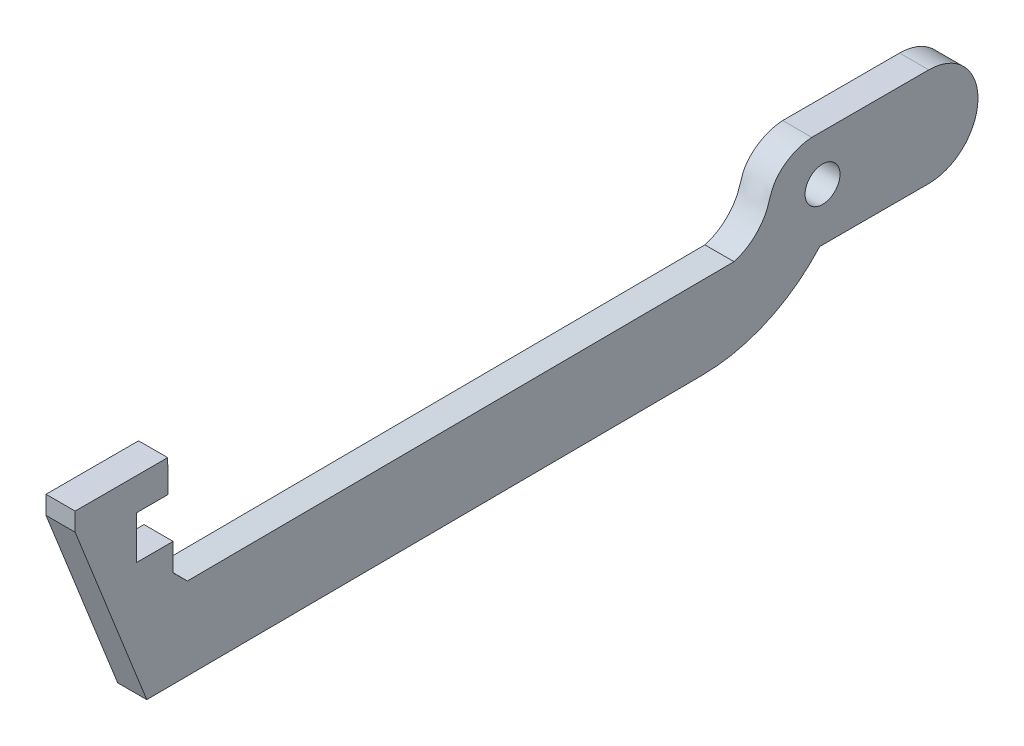
ISO-10303-21;
HEADER;
FILE_DESCRIPTION(('STEP AP214'),'2;1');
FILE_NAME('part.step','',(''),(''),'','','');
FILE_SCHEMA(('AUTOMOTIVE_DESIGN { 1 0 10303 214 1 1 1 1 }'));
ENDSEC;
DATA;
#1=APPLICATION_CONTEXT('core data for automotive mechanical design processes');
#2=APPLICATION_PROTOCOL_DEFINITION('international standard','automotive_design',2000,#1);
#3=PRODUCT_CONTEXT('',#1,'mechanical');
#4=PRODUCT('Part','Part','',(#3));
#5=PRODUCT_RELATED_PRODUCT_CATEGORY('part','',(#4));
#6=PRODUCT_DEFINITION_FORMATION('','',#4);
#7=PRODUCT_DEFINITION_CONTEXT('part definition',#1,'design');
#8=PRODUCT_DEFINITION('design','',#6,#7);
#9=PRODUCT_DEFINITION_SHAPE('','',#8);
#10=(LENGTH_UNIT() NAMED_UNIT(*) SI_UNIT(.MILLI.,.METRE.));
#11=(NAMED_UNIT(*) PLANE_ANGLE_UNIT() SI_UNIT($,.RADIAN.));
#12=(NAMED_UNIT(*) SI_UNIT($,.STERADIAN.) SOLID_ANGLE_UNIT());
#13=UNCERTAINTY_MEASURE_WITH_UNIT(LENGTH_MEASURE(1.E-05),#10,'distance_accuracy_value','');
#14=(GEOMETRIC_REPRESENTATION_CONTEXT(3) GLOBAL_UNCERTAINTY_ASSIGNED_CONTEXT((#13)) GLOBAL_UNIT_ASSIGNED_CONTEXT((#10,
#11,#12)) REPRESENTATION_CONTEXT('',''));
#15=CARTESIAN_POINT('',(0.,0.,0.));
#16=DIRECTION('',(0.,0.,1.));
#17=DIRECTION('',(1.,0.,0.));
#18=AXIS2_PLACEMENT_3D('',#15,#16,#17);
#19=CARTESIAN_POINT('',(2.54,5.34255132185554,-4.57743165751126));
#20=DIRECTION('',(1.,0.,0.));
#21=DIRECTION('',(0.,0.,-1.));
#22=AXIS2_PLACEMENT_3D('',#19,#20,#21);
#23=PLANE('',#22);
#24=DIRECTION('',(0.,-1.,0.));
#25=VECTOR('',#24,1.);
#26=CARTESIAN_POINT('',(2.54,8.68357643470394,50.0984456009479));
#27=LINE('',#26,#25);
#28=CARTESIAN_POINT('',(2.54,8.68357643470394,50.0984456009479));
#29=VERTEX_POINT('',#28);
#30=CARTESIAN_POINT('',(2.54,7.08858013780235,50.0984456009479));
#31=VERTEX_POINT('',#30);
#32=EDGE_CURVE('E214',#29,#31,#27,.T.);
#33=ORIENTED_EDGE('',*,*,#32,.T.);
#34=DIRECTION('',(0.,-0.929681500465451,-0.368364368108952));
#35=VECTOR('',#34,1.);
#36=CARTESIAN_POINT('',(2.54,7.08858013780235,50.0984456009479));
#37=LINE('',#36,#35);
#38=CARTESIAN_POINT('',(2.54,-8.68357643470394,43.8491005439171));
#39=VERTEX_POINT('',#38);
#40=EDGE_CURVE('E117',#31,#39,#37,.T.);
#41=ORIENTED_EDGE('',*,*,#40,.T.);
#42=DIRECTION('',(0.,0.00589535992765672,-0.999982622214668));
#43=VECTOR('',#42,1.);
#44=CARTESIAN_POINT('',(2.54,-8.68357643470394,43.8491005439171));
#45=LINE('',#44,#43);
#46=CARTESIAN_POINT('',(2.54,-8.39760207670546,-4.65843621493681));
#47=VERTEX_POINT('',#46);
#48=EDGE_CURVE('E253',#39,#47,#45,.T.);
#49=ORIENTED_EDGE('',*,*,#48,.T.);
#50=CARTESIAN_POINT('',(2.54,5.34255132185554,-4.57743165751126));
#51=DIRECTION('',(1.,0.,0.));
#52=DIRECTION('',(0.,0.,-1.));
#53=AXIS2_PLACEMENT_3D('',#50,#51,#52);
#54=CIRCLE('',#53,13.7403921761466);
#55=CARTESIAN_POINT('',(2.54,-3.8040165943915,-14.8311467163468));
#56=VERTEX_POINT('',#55);
#57=EDGE_CURVE('E272',#47,#56,#54,.T.);
#58=ORIENTED_EDGE('',*,*,#57,.T.);
#59=DIRECTION('',(0.,0.,-1.));
#60=VECTOR('',#59,1.);
#61=CARTESIAN_POINT('',(2.54,-3.8040165943915,-14.8311467163468));
#62=LINE('',#61,#60);
#63=CARTESIAN_POINT('',(2.54,-3.8040165943915,-24.3340609444598));
#64=VERTEX_POINT('',#63);
#65=EDGE_CURVE('E269',#56,#64,#62,.T.);
#66=ORIENTED_EDGE('',*,*,#65,.T.);
#67=CARTESIAN_POINT('',(2.54,0.491128013845706,-24.3340609444598));
#68=DIRECTION('',(1.,0.,0.));
#69=DIRECTION('',(0.,0.,-1.));
#70=AXIS2_PLACEMENT_3D('',#67,#68,#69);
#71=CIRCLE('',#70,4.2951446082372);
#72=CARTESIAN_POINT('',(2.54,4.78627262208291,-24.3340609444598));
#73=VERTEX_POINT('',#72);
#74=EDGE_CURVE('E271',#64,#73,#71,.T.);
#75=ORIENTED_EDGE('',*,*,#74,.T.);
#76=DIRECTION('',(0.,0.,1.));
#77=VECTOR('',#76,1.);
#78=CARTESIAN_POINT('',(2.54,4.78627262208291,-24.3340609444598));
#79=LINE('',#78,#77);
#80=CARTESIAN_POINT('',(2.54,4.78627262208291,-14.1345902188231));
#81=VERTEX_POINT('',#80);
#82=EDGE_CURVE('E274',#73,#81,#79,.T.);
#83=ORIENTED_EDGE('',*,*,#82,.T.);
#84=CARTESIAN_POINT('',(2.54,4.78627262208291,-14.1345902188231));
#85=CARTESIAN_POINT('',(2.54,4.73144775631799,-12.8433861654983));
#86=CARTESIAN_POINT('',(2.54,3.66079130025576,-10.8140470518953));
#87=CARTESIAN_POINT('',(2.54,0.480505821714619,-10.1658975675965));
#88=CARTESIAN_POINT('',(2.54,-0.85759459417996,-8.61344436264116));
#89=CARTESIAN_POINT('',(2.54,-1.2101195078244,-7.35362341771294));
#90=B_SPLINE_CURVE_WITH_KNOTS('',3,(#84,#85,#86,#87,#88,#89),.UNSPECIFIED.,.F.,.F.,(4,1,1,4),
(0.,0.424423340397801,0.5877625423736,1.),.UNSPECIFIED.);
#91=CARTESIAN_POINT('',(2.54,-1.2101195078244,-7.35362341771294));
#92=VERTEX_POINT('',#91);
#93=EDGE_CURVE('E280',#81,#92,#90,.T.);
#94=ORIENTED_EDGE('',*,*,#93,.T.);
#95=DIRECTION('',(0.,-0.00589535992765674,0.999982622214668));
#96=VECTOR('',#95,1.);
#97=CARTESIAN_POINT('',(2.54,-1.2101195078244,-7.35362341771294));
#98=LINE('',#97,#96);
#99=CARTESIAN_POINT('',(2.54,-1.49108991479145,40.3051332606615));
#100=VERTEX_POINT('',#99);
#101=EDGE_CURVE('E285',#92,#100,#98,.T.);
#102=ORIENTED_EDGE('',*,*,#101,.T.);
#103=DIRECTION('',(0.,0.702925844254296,0.711263142219099));
#104=VECTOR('',#103,1.);
#105=CARTESIAN_POINT('',(2.54,-1.49108991479145,40.3051332606615));
#106=LINE('',#105,#104);
#107=CARTESIAN_POINT('',(2.54,-0.257421692792401,41.55343383633));
#108=VERTEX_POINT('',#107);
#109=EDGE_CURVE('E367',#100,#108,#106,.T.);
#110=ORIENTED_EDGE('',*,*,#109,.T.);
#111=DIRECTION('',(0.,1.,0.));
#112=VECTOR('',#111,1.);
#113=CARTESIAN_POINT('',(2.54,-0.257421692792401,41.55343383633));
#114=LINE('',#113,#112);
#115=CARTESIAN_POINT('',(2.54,2.1221857808194,41.55343383633));
#116=VERTEX_POINT('',#115);
#117=EDGE_CURVE('E359',#108,#116,#114,.T.);
#118=ORIENTED_EDGE('',*,*,#117,.T.);
#119=DIRECTION('',(0.,0.,1.));
#120=VECTOR('',#119,1.);
#121=CARTESIAN_POINT('',(2.54,2.1221857808194,41.55343383633));
#122=LINE('',#121,#120);
#123=CARTESIAN_POINT('',(2.54,2.1221857808194,44.7660524462026));
#124=VERTEX_POINT('',#123);
#125=EDGE_CURVE('E364',#116,#124,#122,.T.);
#126=ORIENTED_EDGE('',*,*,#125,.T.);
#127=DIRECTION('',(0.,1.,0.));
#128=VECTOR('',#127,1.);
#129=CARTESIAN_POINT('',(2.54,2.1221857808194,44.7660524462026));
#130=LINE('',#129,#128);
#131=CARTESIAN_POINT('',(2.54,5.87798165066982,44.7660524462026));
#132=VERTEX_POINT('',#131);
#133=EDGE_CURVE('E160',#124,#132,#130,.T.);
#134=ORIENTED_EDGE('',*,*,#133,.T.);
#135=DIRECTION('',(0.,0.,-1.));
#136=VECTOR('',#135,1.);
#137=CARTESIAN_POINT('',(2.54,5.87798165066982,44.7660524462026));
#138=LINE('',#137,#136);
#139=CARTESIAN_POINT('',(2.54,5.87798165066982,42.0086543473852));
#140=VERTEX_POINT('',#139);
#141=EDGE_CURVE('E154',#132,#140,#138,.T.);
#142=ORIENTED_EDGE('',*,*,#141,.T.);
#143=DIRECTION('',(0.,0.999982622214668,0.00589535992765567));
#144=VECTOR('',#143,1.);
#145=CARTESIAN_POINT('',(2.54,5.87798165066982,42.0086543473852));
#146=LINE('',#145,#144);
#147=CARTESIAN_POINT('',(2.54,8.68357643470394,42.0251946258816));
#148=VERTEX_POINT('',#147);
#149=EDGE_CURVE('E158',#140,#148,#146,.T.);
#150=ORIENTED_EDGE('',*,*,#149,.T.);
#151=DIRECTION('',(0.,0.,1.));
#152=VECTOR('',#151,1.);
#153=CARTESIAN_POINT('',(2.54,8.68357643470394,42.0251946258816));
#154=LINE('',#153,#152);
#155=EDGE_CURVE('E50',#148,#29,#154,.T.);
#156=ORIENTED_EDGE('',*,*,#155,.T.);
#157=EDGE_LOOP('',(#33,#41,#49,#58,#66,#75,#83,#94,#102,#110,#118,#126,#134,#142,#150,#156));
#158=FACE_BOUND('',#157,.T.);
#159=CARTESIAN_POINT('',(2.54,0.779338164604539,-15.0725061798942));
#160=DIRECTION('',(1.,0.,0.));
#161=DIRECTION('',(0.,0.,-1.));
#162=AXIS2_PLACEMENT_3D('',#159,#160,#161);
#163=CIRCLE('',#162,1.524);
#164=CARTESIAN_POINT('',(2.54,0.779338164604539,-16.5965061798942));
#165=VERTEX_POINT('',#164);
#166=EDGE_CURVE('E182',#165,#165,#163,.T.);
#167=ORIENTED_EDGE('',*,*,#166,.F.);
#168=EDGE_LOOP('',(#167));
#169=FACE_BOUND('',#168,.T.);
#170=ADVANCED_FACE('F33',(#158,#169),#23,.T.);
#171=CARTESIAN_POINT('',(0.,5.34255132185554,-4.57743165751126));
#172=DIRECTION('',(1.,0.,0.));
#173=DIRECTION('',(0.,0.,-1.));
#174=AXIS2_PLACEMENT_3D('',#171,#172,#173);
#175=PLANE('',#174);
#176=DIRECTION('',(0.,-1.,0.));
#177=VECTOR('',#176,1.);
#178=CARTESIAN_POINT('',(0.,8.68357643470394,50.0984456009479));
#179=LINE('',#178,#177);
#180=CARTESIAN_POINT('',(0.,8.68357643470394,50.0984456009479));
#181=VERTEX_POINT('',#180);
#182=CARTESIAN_POINT('',(0.,7.08858013780235,50.0984456009479));
#183=VERTEX_POINT('',#182);
#184=EDGE_CURVE('E178',#181,#183,#179,.T.);
#185=ORIENTED_EDGE('',*,*,#184,.F.);
#186=DIRECTION('',(0.,0.,1.));
#187=VECTOR('',#186,1.);
#188=CARTESIAN_POINT('',(0.,8.68357643470394,42.0251946258816));
#189=LINE('',#188,#187);
#190=CARTESIAN_POINT('',(0.,8.68357643470394,42.0251946258816));
#191=VERTEX_POINT('',#190);
#192=EDGE_CURVE('E109',#191,#181,#189,.T.);
#193=ORIENTED_EDGE('',*,*,#192,.F.);
#194=DIRECTION('',(0.,0.999982622214668,0.00589535992765567));
#195=VECTOR('',#194,1.);
#196=CARTESIAN_POINT('',(0.,5.87798165066982,42.0086543473852));
#197=LINE('',#196,#195);
#198=CARTESIAN_POINT('',(0.,5.87798165066982,42.0086543473852));
#199=VERTEX_POINT('',#198);
#200=EDGE_CURVE('E103',#199,#191,#197,.T.);
#201=ORIENTED_EDGE('',*,*,#200,.F.);
#202=DIRECTION('',(0.,0.,-1.));
#203=VECTOR('',#202,1.);
#204=CARTESIAN_POINT('',(0.,5.87798165066982,44.7660524462026));
#205=LINE('',#204,#203);
#206=CARTESIAN_POINT('',(0.,5.87798165066982,44.7660524462026));
#207=VERTEX_POINT('',#206);
#208=EDGE_CURVE('E168',#207,#199,#205,.T.);
#209=ORIENTED_EDGE('',*,*,#208,.F.);
#210=DIRECTION('',(0.,1.,0.));
#211=VECTOR('',#210,1.);
#212=CARTESIAN_POINT('',(0.,2.1221857808194,44.7660524462026));
#213=LINE('',#212,#211);
#214=CARTESIAN_POINT('',(0.,2.1221857808194,44.7660524462026));
#215=VERTEX_POINT('',#214);
#216=EDGE_CURVE('E209',#215,#207,#213,.T.);
#217=ORIENTED_EDGE('',*,*,#216,.F.);
#218=DIRECTION('',(0.,0.,1.));
#219=VECTOR('',#218,1.);
#220=CARTESIAN_POINT('',(0.,2.1221857808194,41.55343383633));
#221=LINE('',#220,#219);
#222=CARTESIAN_POINT('',(0.,2.1221857808194,41.55343383633));
#223=VERTEX_POINT('',#222);
#224=EDGE_CURVE('E207',#223,#215,#221,.T.);
#225=ORIENTED_EDGE('',*,*,#224,.F.);
#226=DIRECTION('',(0.,1.,0.));
#227=VECTOR('',#226,1.);
#228=CARTESIAN_POINT('',(0.,-0.257421692792401,41.55343383633));
#229=LINE('',#228,#227);
#230=CARTESIAN_POINT('',(0.,-0.257421692792401,41.55343383633));
#231=VERTEX_POINT('',#230);
#232=EDGE_CURVE('E205',#231,#223,#229,.T.);
#233=ORIENTED_EDGE('',*,*,#232,.F.);
#234=DIRECTION('',(0.,0.702925844254296,0.711263142219099));
#235=VECTOR('',#234,1.);
#236=CARTESIAN_POINT('',(0.,-1.49108991479145,40.3051332606615));
#237=LINE('',#236,#235);
#238=CARTESIAN_POINT('',(0.,-1.49108991479145,40.3051332606615));
#239=VERTEX_POINT('',#238);
#240=EDGE_CURVE('E203',#239,#231,#237,.T.);
#241=ORIENTED_EDGE('',*,*,#240,.F.);
#242=DIRECTION('',(0.,-0.00589535992765674,0.999982622214668));
#243=VECTOR('',#242,1.);
#244=CARTESIAN_POINT('',(0.,-1.2101195078244,-7.35362341771294));
#245=LINE('',#244,#243);
#246=CARTESIAN_POINT('',(0.,-1.2101195078244,-7.35362341771294));
#247=VERTEX_POINT('',#246);
#248=EDGE_CURVE('E198',#247,#239,#245,.T.);
#249=ORIENTED_EDGE('',*,*,#248,.F.);
#250=CARTESIAN_POINT('',(0.,4.78627262208291,-14.1345902188231));
#251=CARTESIAN_POINT('',(0.,4.73144775631799,-12.8433861654983));
#252=CARTESIAN_POINT('',(0.,3.66079130025576,-10.8140470518953));
#253=CARTESIAN_POINT('',(0.,0.480505821714619,-10.1658975675965));
#254=CARTESIAN_POINT('',(0.,-0.85759459417996,-8.61344436264116));
#255=CARTESIAN_POINT('',(0.,-1.2101195078244,-7.35362341771294));
#256=B_SPLINE_CURVE_WITH_KNOTS('',3,(#250,#251,#252,#253,#254,#255),.UNSPECIFIED.,.F.,.F.,(4,1,
1,4),(0.,0.424423340397801,0.5877625423736,1.),.UNSPECIFIED.);
#257=CARTESIAN_POINT('',(0.,4.78627262208291,-14.1345902188231));
#258=VERTEX_POINT('',#257);
#259=EDGE_CURVE('E194',#258,#247,#256,.T.);
#260=ORIENTED_EDGE('',*,*,#259,.F.);
#261=DIRECTION('',(0.,0.,1.));
#262=VECTOR('',#261,1.);
#263=CARTESIAN_POINT('',(0.,4.78627262208291,-24.3340609444598));
#264=LINE('',#263,#262);
#265=CARTESIAN_POINT('',(0.,4.78627262208291,-24.3340609444598));
#266=VERTEX_POINT('',#265);
#267=EDGE_CURVE('E192',#266,#258,#264,.T.);
#268=ORIENTED_EDGE('',*,*,#267,.F.);
#269=CARTESIAN_POINT('',(0.,0.491128013845706,-24.3340609444598));
#270=DIRECTION('',(1.,0.,0.));
#271=DIRECTION('',(0.,0.,-1.));
#272=AXIS2_PLACEMENT_3D('',#269,#270,#271);
#273=CIRCLE('',#272,4.2951446082372);
#274=CARTESIAN_POINT('',(0.,-3.8040165943915,-24.3340609444598));
#275=VERTEX_POINT('',#274);
#276=EDGE_CURVE('E190',#275,#266,#273,.T.);
#277=ORIENTED_EDGE('',*,*,#276,.F.);
#278=DIRECTION('',(0.,0.,-1.));
#279=VECTOR('',#278,1.);
#280=CARTESIAN_POINT('',(0.,-3.8040165943915,-14.8311467163468));
#281=LINE('',#280,#279);
#282=CARTESIAN_POINT('',(0.,-3.8040165943915,-14.8311467163468));
#283=VERTEX_POINT('',#282);
#284=EDGE_CURVE('E188',#283,#275,#281,.T.);
#285=ORIENTED_EDGE('',*,*,#284,.F.);
#286=CARTESIAN_POINT('',(0.,5.34255132185554,-4.57743165751126));
#287=DIRECTION('',(1.,0.,0.));
#288=DIRECTION('',(0.,0.,-1.));
#289=AXIS2_PLACEMENT_3D('',#286,#287,#288);
#290=CIRCLE('',#289,13.7403921761466);
#291=CARTESIAN_POINT('',(0.,-8.39760207670546,-4.65843621493681));
#292=VERTEX_POINT('',#291);
#293=EDGE_CURVE('E186',#292,#283,#290,.T.);
#294=ORIENTED_EDGE('',*,*,#293,.F.);
#295=DIRECTION('',(0.,0.00589535992765672,-0.999982622214668));
#296=VECTOR('',#295,1.);
#297=CARTESIAN_POINT('',(0.,-8.68357643470394,43.8491005439171));
#298=LINE('',#297,#296);
#299=CARTESIAN_POINT('',(0.,-8.68357643470394,43.8491005439171));
#300=VERTEX_POINT('',#299);
#301=EDGE_CURVE('E184',#300,#292,#298,.T.);
#302=ORIENTED_EDGE('',*,*,#301,.F.);
#303=DIRECTION('',(0.,-0.929681500465451,-0.368364368108952));
#304=VECTOR('',#303,1.);
#305=CARTESIAN_POINT('',(0.,7.08858013780235,50.0984456009479));
#306=LINE('',#305,#304);
#307=EDGE_CURVE('E181',#183,#300,#306,.T.);
#308=ORIENTED_EDGE('',*,*,#307,.F.);
#309=EDGE_LOOP('',(#185,#193,#201,#209,#217,#225,#233,#241,#249,#260,#268,#277,#285,#294,#302,#308));
#310=FACE_BOUND('',#309,.T.);
#311=CARTESIAN_POINT('',(0.,0.779338164604539,-15.0725061798942));
#312=DIRECTION('',(1.,0.,0.));
#313=DIRECTION('',(0.,0.,-1.));
#314=AXIS2_PLACEMENT_3D('',#311,#312,#313);
#315=CIRCLE('',#314,1.524);
#316=CARTESIAN_POINT('',(0.,0.779338164604539,-16.5965061798942));
#317=VERTEX_POINT('',#316);
#318=EDGE_CURVE('E381',#317,#317,#315,.T.);
#319=ORIENTED_EDGE('',*,*,#318,.T.);
#320=EDGE_LOOP('',(#319));
#321=FACE_BOUND('',#320,.T.);
#322=ADVANCED_FACE('F257',(#310,#321),#175,.F.);
#323=CARTESIAN_POINT('',(2.54,8.68357643470394,50.0984456009479));
#324=DIRECTION('',(0.,0.,-1.));
#325=DIRECTION('',(-1.,0.,0.));
#326=AXIS2_PLACEMENT_3D('',#323,#324,#325);
#327=PLANE('',#326);
#328=ORIENTED_EDGE('',*,*,#184,.T.);
#329=DIRECTION('',(-1.,0.,0.));
#330=VECTOR('',#329,1.);
#331=CARTESIAN_POINT('',(2.54,7.08858013780235,50.0984456009479));
#332=LINE('',#331,#330);
#333=EDGE_CURVE('E11',#31,#183,#332,.T.);
#334=ORIENTED_EDGE('',*,*,#333,.F.);
#335=ORIENTED_EDGE('',*,*,#32,.F.);
#336=DIRECTION('',(-1.,0.,0.));
#337=VECTOR('',#336,1.);
#338=CARTESIAN_POINT('',(2.54,8.68357643470394,50.0984456009479));
#339=LINE('',#338,#337);
#340=EDGE_CURVE('E174',#29,#181,#339,.T.);
#341=ORIENTED_EDGE('',*,*,#340,.T.);
#342=EDGE_LOOP('',(#328,#334,#335,#341));
#343=FACE_BOUND('',#342,.T.);
#344=ADVANCED_FACE('F35',(#343),#327,.F.);
#345=CARTESIAN_POINT('',(2.54,7.08858013780235,50.0984456009479));
#346=DIRECTION('',(0.,0.368364368108952,-0.929681500465451));
#347=DIRECTION('',(0.,0.929681500465451,0.368364368108952));
#348=AXIS2_PLACEMENT_3D('',#345,#346,#347);
#349=PLANE('',#348);
#350=ORIENTED_EDGE('',*,*,#307,.T.);
#351=DIRECTION('',(-1.,0.,0.));
#352=VECTOR('',#351,1.);
#353=CARTESIAN_POINT('',(2.54,-8.68357643470394,43.8491005439171));
#354=LINE('',#353,#352);
#355=EDGE_CURVE('E42',#39,#300,#354,.T.);
#356=ORIENTED_EDGE('',*,*,#355,.F.);
#357=ORIENTED_EDGE('',*,*,#40,.F.);
#358=ORIENTED_EDGE('',*,*,#333,.T.);
#359=EDGE_LOOP('',(#350,#356,#357,#358));
#360=FACE_BOUND('',#359,.T.);
#361=ADVANCED_FACE('F311',(#360),#349,.F.);
#362=CARTESIAN_POINT('',(2.54,-8.68357643470394,43.8491005439171));
#363=DIRECTION('',(0.,0.999982622214668,0.00589535992765672));
#364=DIRECTION('',(0.,-0.00589535992765672,0.999982622214668));
#365=AXIS2_PLACEMENT_3D('',#362,#363,#364);
#366=PLANE('',#365);
#367=ORIENTED_EDGE('',*,*,#301,.T.);
#368=DIRECTION('',(-1.,0.,0.));
#369=VECTOR('',#368,1.);
#370=CARTESIAN_POINT('',(2.54,-8.39760207670546,-4.65843621493681));
#371=LINE('',#370,#369);
#372=EDGE_CURVE('E245',#47,#292,#371,.T.);
#373=ORIENTED_EDGE('',*,*,#372,.F.);
#374=ORIENTED_EDGE('',*,*,#48,.F.);
#375=ORIENTED_EDGE('',*,*,#355,.T.);
#376=EDGE_LOOP('',(#367,#373,#374,#375));
#377=FACE_BOUND('',#376,.T.);
#378=ADVANCED_FACE('F251',(#377),#366,.F.);
#379=CARTESIAN_POINT('',(2.54,5.34255132185554,-4.57743165751126));
#380=DIRECTION('',(-1.,0.,0.));
#381=DIRECTION('',(0.,0.,1.));
#382=AXIS2_PLACEMENT_3D('',#379,#380,#381);
#383=CYLINDRICAL_SURFACE('',#382,13.7403921761466);
#384=ORIENTED_EDGE('',*,*,#293,.T.);
#385=DIRECTION('',(-1.,0.,0.));
#386=VECTOR('',#385,1.);
#387=CARTESIAN_POINT('',(2.54,-3.8040165943915,-14.8311467163468));
#388=LINE('',#387,#386);
#389=EDGE_CURVE('E242',#56,#283,#388,.T.);
#390=ORIENTED_EDGE('',*,*,#389,.F.);
#391=ORIENTED_EDGE('',*,*,#57,.F.);
#392=ORIENTED_EDGE('',*,*,#372,.T.);
#393=EDGE_LOOP('',(#384,#390,#391,#392));
#394=FACE_BOUND('',#393,.T.);
#395=ADVANCED_FACE('F263',(#394),#383,.T.);
#396=CARTESIAN_POINT('',(2.54,-3.8040165943915,-14.8311467163468));
#397=DIRECTION('',(0.,1.,0.));
#398=DIRECTION('',(0.,0.,1.));
#399=AXIS2_PLACEMENT_3D('',#396,#397,#398);
#400=PLANE('',#399);
#401=ORIENTED_EDGE('',*,*,#284,.T.);
#402=DIRECTION('',(-1.,0.,0.));
#403=VECTOR('',#402,1.);
#404=CARTESIAN_POINT('',(2.54,-3.8040165943915,-24.3340609444598));
#405=LINE('',#404,#403);
#406=EDGE_CURVE('E239',#64,#275,#405,.T.);
#407=ORIENTED_EDGE('',*,*,#406,.F.);
#408=ORIENTED_EDGE('',*,*,#65,.F.);
#409=ORIENTED_EDGE('',*,*,#389,.T.);
#410=EDGE_LOOP('',(#401,#407,#408,#409));
#411=FACE_BOUND('',#410,.T.);
#412=ADVANCED_FACE('F267',(#411),#400,.F.);
#413=CARTESIAN_POINT('',(2.54,0.491128013845706,-24.3340609444598));
#414=DIRECTION('',(-1.,0.,0.));
#415=DIRECTION('',(0.,0.,1.));
#416=AXIS2_PLACEMENT_3D('',#413,#414,#415);
#417=CYLINDRICAL_SURFACE('',#416,4.2951446082372);
#418=ORIENTED_EDGE('',*,*,#276,.T.);
#419=DIRECTION('',(-1.,0.,0.));
#420=VECTOR('',#419,1.);
#421=CARTESIAN_POINT('',(2.54,4.78627262208291,-24.3340609444598));
#422=LINE('',#421,#420);
#423=EDGE_CURVE('E236',#73,#266,#422,.T.);
#424=ORIENTED_EDGE('',*,*,#423,.F.);
#425=ORIENTED_EDGE('',*,*,#74,.F.);
#426=ORIENTED_EDGE('',*,*,#406,.T.);
#427=EDGE_LOOP('',(#418,#424,#425,#426));
#428=FACE_BOUND('',#427,.T.);
#429=ADVANCED_FACE('F301',(#428),#417,.T.);
#430=CARTESIAN_POINT('',(2.54,4.78627262208291,-24.3340609444598));
#431=DIRECTION('',(0.,-1.,0.));
#432=DIRECTION('',(0.,0.,-1.));
#433=AXIS2_PLACEMENT_3D('',#430,#431,#432);
#434=PLANE('',#433);
#435=ORIENTED_EDGE('',*,*,#267,.T.);
#436=DIRECTION('',(-1.,0.,0.));
#437=VECTOR('',#436,1.);
#438=CARTESIAN_POINT('',(2.54,4.78627262208291,-14.1345902188231));
#439=LINE('',#438,#437);
#440=EDGE_CURVE('E233',#81,#258,#439,.T.);
#441=ORIENTED_EDGE('',*,*,#440,.F.);
#442=ORIENTED_EDGE('',*,*,#82,.F.);
#443=ORIENTED_EDGE('',*,*,#423,.T.);
#444=EDGE_LOOP('',(#435,#441,#442,#443));
#445=FACE_BOUND('',#444,.T.);
#446=ADVANCED_FACE('F296',(#445),#434,.F.);
#447=DIRECTION('',(-1.,0.,0.));
#448=VECTOR('',#447,1.);
#449=SURFACE_OF_LINEAR_EXTRUSION('',#90,#448);
#450=ORIENTED_EDGE('',*,*,#259,.T.);
#451=DIRECTION('',(-1.,0.,0.));
#452=VECTOR('',#451,1.);
#453=CARTESIAN_POINT('',(2.54,-1.2101195078244,-7.35362341771294));
#454=LINE('',#453,#452);
#455=EDGE_CURVE('E230',#92,#247,#454,.T.);
#456=ORIENTED_EDGE('',*,*,#455,.F.);
#457=ORIENTED_EDGE('',*,*,#93,.F.);
#458=ORIENTED_EDGE('',*,*,#440,.T.);
#459=EDGE_LOOP('',(#450,#456,#457,#458));
#460=FACE_BOUND('',#459,.T.);
#461=ADVANCED_FACE('F291',(#460),#449,.F.);
#462=CARTESIAN_POINT('',(2.54,-1.2101195078244,-7.35362341771294));
#463=DIRECTION('',(0.,-0.999982622214668,-0.00589535992765674));
#464=DIRECTION('',(0.,0.00589535992765674,-0.999982622214668));
#465=AXIS2_PLACEMENT_3D('',#462,#463,#464);
#466=PLANE('',#465);
#467=ORIENTED_EDGE('',*,*,#248,.T.);
#468=DIRECTION('',(-1.,0.,0.));
#469=VECTOR('',#468,1.);
#470=CARTESIAN_POINT('',(2.54,-1.49108991479145,40.3051332606615));
#471=LINE('',#470,#469);
#472=EDGE_CURVE('E227',#100,#239,#471,.T.);
#473=ORIENTED_EDGE('',*,*,#472,.F.);
#474=ORIENTED_EDGE('',*,*,#101,.F.);
#475=ORIENTED_EDGE('',*,*,#455,.T.);
#476=EDGE_LOOP('',(#467,#473,#474,#475));
#477=FACE_BOUND('',#476,.T.);
#478=ADVANCED_FACE('F295',(#477),#466,.F.);
#479=CARTESIAN_POINT('',(2.54,-1.49108991479145,40.3051332606615));
#480=DIRECTION('',(0.,-0.711263142219099,0.702925844254296));
#481=DIRECTION('',(0.,-0.702925844254296,-0.711263142219099));
#482=AXIS2_PLACEMENT_3D('',#479,#480,#481);
#483=PLANE('',#482);
#484=ORIENTED_EDGE('',*,*,#240,.T.);
#485=DIRECTION('',(-1.,0.,0.));
#486=VECTOR('',#485,1.);
#487=CARTESIAN_POINT('',(2.54,-0.257421692792401,41.55343383633));
#488=LINE('',#487,#486);
#489=EDGE_CURVE('E224',#108,#231,#488,.T.);
#490=ORIENTED_EDGE('',*,*,#489,.F.);
#491=ORIENTED_EDGE('',*,*,#109,.F.);
#492=ORIENTED_EDGE('',*,*,#472,.T.);
#493=EDGE_LOOP('',(#484,#490,#491,#492));
#494=FACE_BOUND('',#493,.T.);
#495=ADVANCED_FACE('F343',(#494),#483,.F.);
#496=CARTESIAN_POINT('',(2.54,-0.257421692792401,41.55343383633));
#497=DIRECTION('',(0.,0.,1.));
#498=DIRECTION('',(1.,0.,0.));
#499=AXIS2_PLACEMENT_3D('',#496,#497,#498);
#500=PLANE('',#499);
#501=ORIENTED_EDGE('',*,*,#232,.T.);
#502=DIRECTION('',(-1.,0.,0.));
#503=VECTOR('',#502,1.);
#504=CARTESIAN_POINT('',(2.54,2.1221857808194,41.55343383633));
#505=LINE('',#504,#503);
#506=EDGE_CURVE('E221',#116,#223,#505,.T.);
#507=ORIENTED_EDGE('',*,*,#506,.F.);
#508=ORIENTED_EDGE('',*,*,#117,.F.);
#509=ORIENTED_EDGE('',*,*,#489,.T.);
#510=EDGE_LOOP('',(#501,#507,#508,#509));
#511=FACE_BOUND('',#510,.T.);
#512=ADVANCED_FACE('F340',(#511),#500,.F.);
#513=CARTESIAN_POINT('',(2.54,2.1221857808194,41.55343383633));
#514=DIRECTION('',(0.,-1.,0.));
#515=DIRECTION('',(0.,0.,-1.));
#516=AXIS2_PLACEMENT_3D('',#513,#514,#515);
#517=PLANE('',#516);
#518=ORIENTED_EDGE('',*,*,#224,.T.);
#519=DIRECTION('',(-1.,0.,0.));
#520=VECTOR('',#519,1.);
#521=CARTESIAN_POINT('',(2.54,2.1221857808194,44.7660524462026));
#522=LINE('',#521,#520);
#523=EDGE_CURVE('E218',#124,#215,#522,.T.);
#524=ORIENTED_EDGE('',*,*,#523,.F.);
#525=ORIENTED_EDGE('',*,*,#125,.F.);
#526=ORIENTED_EDGE('',*,*,#506,.T.);
#527=EDGE_LOOP('',(#518,#524,#525,#526));
#528=FACE_BOUND('',#527,.T.);
#529=ADVANCED_FACE('F336',(#528),#517,.F.);
#530=CARTESIAN_POINT('',(2.54,2.1221857808194,44.7660524462026));
#531=DIRECTION('',(0.,0.,1.));
#532=DIRECTION('',(1.,0.,0.));
#533=AXIS2_PLACEMENT_3D('',#530,#531,#532);
#534=PLANE('',#533);
#535=ORIENTED_EDGE('',*,*,#216,.T.);
#536=DIRECTION('',(-1.,0.,0.));
#537=VECTOR('',#536,1.);
#538=CARTESIAN_POINT('',(2.54,5.87798165066982,44.7660524462026));
#539=LINE('',#538,#537);
#540=EDGE_CURVE('E169',#132,#207,#539,.T.);
#541=ORIENTED_EDGE('',*,*,#540,.F.);
#542=ORIENTED_EDGE('',*,*,#133,.F.);
#543=ORIENTED_EDGE('',*,*,#523,.T.);
#544=EDGE_LOOP('',(#535,#541,#542,#543));
#545=FACE_BOUND('',#544,.T.);
#546=ADVANCED_FACE('F333',(#545),#534,.F.);
#547=CARTESIAN_POINT('',(2.54,5.87798165066982,44.7660524462026));
#548=DIRECTION('',(0.,1.,0.));
#549=DIRECTION('',(0.,0.,1.));
#550=AXIS2_PLACEMENT_3D('',#547,#548,#549);
#551=PLANE('',#550);
#552=ORIENTED_EDGE('',*,*,#208,.T.);
#553=DIRECTION('',(-1.,0.,0.));
#554=VECTOR('',#553,1.);
#555=CARTESIAN_POINT('',(2.54,5.87798165066982,42.0086543473852));
#556=LINE('',#555,#554);
#557=EDGE_CURVE('E165',#140,#199,#556,.T.);
#558=ORIENTED_EDGE('',*,*,#557,.F.);
#559=ORIENTED_EDGE('',*,*,#141,.F.);
#560=ORIENTED_EDGE('',*,*,#540,.T.);
#561=EDGE_LOOP('',(#552,#558,#559,#560));
#562=FACE_BOUND('',#561,.T.);
#563=ADVANCED_FACE('F166',(#562),#551,.F.);
#564=CARTESIAN_POINT('',(2.54,5.87798165066982,42.0086543473852));
#565=DIRECTION('',(0.,-0.00589535992765567,0.999982622214668));
#566=DIRECTION('',(0.,-0.999982622214668,-0.00589535992765567));
#567=AXIS2_PLACEMENT_3D('',#564,#565,#566);
#568=PLANE('',#567);
#569=ORIENTED_EDGE('',*,*,#200,.T.);
#570=DIRECTION('',(-1.,0.,0.));
#571=VECTOR('',#570,1.);
#572=CARTESIAN_POINT('',(2.54,8.68357643470394,42.0251946258816));
#573=LINE('',#572,#571);
#574=EDGE_CURVE('E170',#148,#191,#573,.T.);
#575=ORIENTED_EDGE('',*,*,#574,.F.);
#576=ORIENTED_EDGE('',*,*,#149,.F.);
#577=ORIENTED_EDGE('',*,*,#557,.T.);
#578=EDGE_LOOP('',(#569,#575,#576,#577));
#579=FACE_BOUND('',#578,.T.);
#580=ADVANCED_FACE('F172',(#579),#568,.F.);
#581=CARTESIAN_POINT('',(2.54,8.68357643470394,42.0251946258816));
#582=DIRECTION('',(0.,-1.,0.));
#583=DIRECTION('',(0.,0.,-1.));
#584=AXIS2_PLACEMENT_3D('',#581,#582,#583);
#585=PLANE('',#584);
#586=ORIENTED_EDGE('',*,*,#192,.T.);
#587=ORIENTED_EDGE('',*,*,#340,.F.);
#588=ORIENTED_EDGE('',*,*,#155,.F.);
#589=ORIENTED_EDGE('',*,*,#574,.T.);
#590=EDGE_LOOP('',(#586,#587,#588,#589));
#591=FACE_BOUND('',#590,.T.);
#592=ADVANCED_FACE('F326',(#591),#585,.F.);
#593=CARTESIAN_POINT('',(2.54,0.779338164604539,-15.0725061798942));
#594=DIRECTION('',(-1.,0.,0.));
#595=DIRECTION('',(0.,0.,1.));
#596=AXIS2_PLACEMENT_3D('',#593,#594,#595);
#597=CYLINDRICAL_SURFACE('',#596,1.524);
#598=ORIENTED_EDGE('',*,*,#166,.T.);
#599=EDGE_LOOP('',(#598));
#600=FACE_BOUND('',#599,.T.);
#601=ORIENTED_EDGE('',*,*,#318,.F.);
#602=EDGE_LOOP('',(#601));
#603=FACE_BOUND('',#602,.T.);
#604=ADVANCED_FACE('F324',(#600,#603),#597,.F.);
#605=CLOSED_SHELL('',(#170,#322,#344,#361,#378,#395,#412,#429,#446,#461,#478,#495,#512,#529,
#546,#563,#580,#592,#604));
#606=MANIFOLD_SOLID_BREP('B2',#605);
#607=ADVANCED_BREP_SHAPE_REPRESENTATION('',(#18,#606),#14);
#608=SHAPE_DEFINITION_REPRESENTATION(#9,#607);
ENDSEC;
END-ISO-10303-21;
